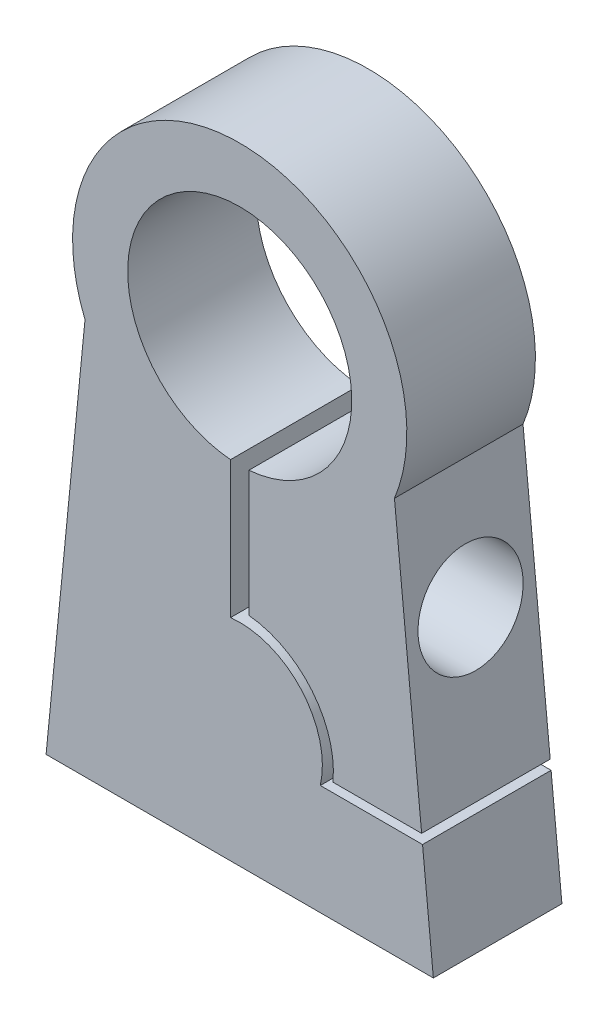
ISO-10303-21;
HEADER;
FILE_DESCRIPTION(('STEP AP214'),'2;1');
FILE_NAME('part.step','',(''),(''),'','','');
FILE_SCHEMA(('AUTOMOTIVE_DESIGN { 1 0 10303 214 1 1 1 1 }'));
ENDSEC;
DATA;
#1=APPLICATION_CONTEXT('core data for automotive mechanical design processes');
#2=APPLICATION_PROTOCOL_DEFINITION('international standard','automotive_design',2000,#1);
#3=PRODUCT_CONTEXT('',#1,'mechanical');
#4=PRODUCT('Part','Part','',(#3));
#5=PRODUCT_RELATED_PRODUCT_CATEGORY('part','',(#4));
#6=PRODUCT_DEFINITION_FORMATION('','',#4);
#7=PRODUCT_DEFINITION_CONTEXT('part definition',#1,'design');
#8=PRODUCT_DEFINITION('design','',#6,#7);
#9=PRODUCT_DEFINITION_SHAPE('','',#8);
#10=(LENGTH_UNIT() NAMED_UNIT(*) SI_UNIT(.MILLI.,.METRE.));
#11=(NAMED_UNIT(*) PLANE_ANGLE_UNIT() SI_UNIT($,.RADIAN.));
#12=(NAMED_UNIT(*) SI_UNIT($,.STERADIAN.) SOLID_ANGLE_UNIT());
#13=UNCERTAINTY_MEASURE_WITH_UNIT(LENGTH_MEASURE(1.E-05),#10,'distance_accuracy_value','');
#14=(GEOMETRIC_REPRESENTATION_CONTEXT(3) GLOBAL_UNCERTAINTY_ASSIGNED_CONTEXT((#13)) GLOBAL_UNIT_ASSIGNED_CONTEXT((#10,
#11,#12)) REPRESENTATION_CONTEXT('',''));
#15=CARTESIAN_POINT('',(0.,0.,0.));
#16=DIRECTION('',(0.,0.,1.));
#17=DIRECTION('',(1.,0.,0.));
#18=AXIS2_PLACEMENT_3D('',#15,#16,#17);
#19=CARTESIAN_POINT('',(3.29089653438087,-19.4,0.));
#20=DIRECTION('',(1.,0.,0.));
#21=DIRECTION('',(0.,0.,-1.));
#22=AXIS2_PLACEMENT_3D('',#19,#20,#21);
#23=PLANE('',#22);
#24=DIRECTION('',(0.,0.,1.));
#25=VECTOR('',#24,1.);
#26=CARTESIAN_POINT('',(3.29089653438087,-22.,0.));
#27=LINE('',#26,#25);
#28=CARTESIAN_POINT('',(3.29089653438087,-22.,0.));
#29=VERTEX_POINT('',#28);
#30=CARTESIAN_POINT('',(3.29089653438087,-22.,2.85));
#31=VERTEX_POINT('',#30);
#32=EDGE_CURVE('E261',#29,#31,#27,.T.);
#33=ORIENTED_EDGE('',*,*,#32,.T.);
#34=DIRECTION('',(0.,-1.,0.));
#35=VECTOR('',#34,1.);
#36=CARTESIAN_POINT('',(3.29089653438087,-19.4,2.85));
#37=LINE('',#36,#35);
#38=CARTESIAN_POINT('',(3.29089653438087,-19.4,2.85));
#39=VERTEX_POINT('',#38);
#40=EDGE_CURVE('E255',#39,#31,#37,.T.);
#41=ORIENTED_EDGE('',*,*,#40,.F.);
#42=DIRECTION('',(0.,0.,1.));
#43=VECTOR('',#42,1.);
#44=CARTESIAN_POINT('',(3.29089653438087,-19.4,0.));
#45=LINE('',#44,#43);
#46=CARTESIAN_POINT('',(3.29089653438087,-19.4,0.));
#47=VERTEX_POINT('',#46);
#48=EDGE_CURVE('E258',#47,#39,#45,.T.);
#49=ORIENTED_EDGE('',*,*,#48,.F.);
#50=DIRECTION('',(0.,-1.,0.));
#51=VECTOR('',#50,1.);
#52=CARTESIAN_POINT('',(3.29089653438087,-19.4,0.));
#53=LINE('',#52,#51);
#54=EDGE_CURVE('E306',#47,#29,#53,.T.);
#55=ORIENTED_EDGE('',*,*,#54,.T.);
#56=EDGE_LOOP('',(#33,#41,#49,#55));
#57=FACE_BOUND('',#56,.T.);
#58=ADVANCED_FACE('F94',(#57),#23,.F.);
#59=CARTESIAN_POINT('',(1.64544826719043,-19.4,-2.85));
#60=DIRECTION('',(0.866025403784439,0.,-0.5));
#61=DIRECTION('',(-0.5,0.,-0.866025403784439));
#62=AXIS2_PLACEMENT_3D('',#59,#60,#61);
#63=PLANE('',#62);
#64=DIRECTION('',(0.5,0.,0.866025403784439));
#65=VECTOR('',#64,1.);
#66=CARTESIAN_POINT('',(1.64544826719043,-22.,-2.85));
#67=LINE('',#66,#65);
#68=CARTESIAN_POINT('',(1.64544826719043,-22.,-2.85));
#69=VERTEX_POINT('',#68);
#70=EDGE_CURVE('E279',#69,#29,#67,.T.);
#71=ORIENTED_EDGE('',*,*,#70,.T.);
#72=ORIENTED_EDGE('',*,*,#54,.F.);
#73=DIRECTION('',(0.5,0.,0.866025403784439));
#74=VECTOR('',#73,1.);
#75=CARTESIAN_POINT('',(1.64544826719043,-19.4,-2.85));
#76=LINE('',#75,#74);
#77=CARTESIAN_POINT('',(1.64544826719043,-19.4,-2.85));
#78=VERTEX_POINT('',#77);
#79=EDGE_CURVE('E266',#78,#47,#76,.T.);
#80=ORIENTED_EDGE('',*,*,#79,.F.);
#81=DIRECTION('',(0.,-1.,0.));
#82=VECTOR('',#81,1.);
#83=CARTESIAN_POINT('',(1.64544826719043,-19.4,-2.85));
#84=LINE('',#83,#82);
#85=EDGE_CURVE('E309',#78,#69,#84,.T.);
#86=ORIENTED_EDGE('',*,*,#85,.T.);
#87=EDGE_LOOP('',(#71,#72,#80,#86));
#88=FACE_BOUND('',#87,.T.);
#89=ADVANCED_FACE('F532',(#88),#63,.F.);
#90=CARTESIAN_POINT('',(-1.64544826719043,-19.4,-2.85));
#91=DIRECTION('',(0.,0.,-1.));
#92=DIRECTION('',(-1.,0.,0.));
#93=AXIS2_PLACEMENT_3D('',#90,#91,#92);
#94=PLANE('',#93);
#95=DIRECTION('',(1.,0.,0.));
#96=VECTOR('',#95,1.);
#97=CARTESIAN_POINT('',(-1.64544826719043,-22.,-2.85));
#98=LINE('',#97,#96);
#99=CARTESIAN_POINT('',(-1.64544826719043,-22.,-2.85));
#100=VERTEX_POINT('',#99);
#101=EDGE_CURVE('E282',#100,#69,#98,.T.);
#102=ORIENTED_EDGE('',*,*,#101,.T.);
#103=ORIENTED_EDGE('',*,*,#85,.F.);
#104=DIRECTION('',(1.,0.,0.));
#105=VECTOR('',#104,1.);
#106=CARTESIAN_POINT('',(-1.64544826719043,-19.4,-2.85));
#107=LINE('',#106,#105);
#108=CARTESIAN_POINT('',(-1.64544826719043,-19.4,-2.85));
#109=VERTEX_POINT('',#108);
#110=EDGE_CURVE('E292',#109,#78,#107,.T.);
#111=ORIENTED_EDGE('',*,*,#110,.F.);
#112=DIRECTION('',(0.,-1.,0.));
#113=VECTOR('',#112,1.);
#114=CARTESIAN_POINT('',(-1.64544826719043,-19.4,-2.85));
#115=LINE('',#114,#113);
#116=EDGE_CURVE('E311',#109,#100,#115,.T.);
#117=ORIENTED_EDGE('',*,*,#116,.T.);
#118=EDGE_LOOP('',(#102,#103,#111,#117));
#119=FACE_BOUND('',#118,.T.);
#120=ADVANCED_FACE('F538',(#119),#94,.F.);
#121=CARTESIAN_POINT('',(-3.29089653438087,-19.4,0.));
#122=DIRECTION('',(-0.866025403784439,0.,-0.5));
#123=DIRECTION('',(-0.5,0.,0.866025403784439));
#124=AXIS2_PLACEMENT_3D('',#121,#122,#123);
#125=PLANE('',#124);
#126=DIRECTION('',(0.5,0.,-0.866025403784439));
#127=VECTOR('',#126,1.);
#128=CARTESIAN_POINT('',(-3.29089653438087,-22.,0.));
#129=LINE('',#128,#127);
#130=CARTESIAN_POINT('',(-3.29089653438087,-22.,0.));
#131=VERTEX_POINT('',#130);
#132=EDGE_CURVE('E301',#131,#100,#129,.T.);
#133=ORIENTED_EDGE('',*,*,#132,.T.);
#134=ORIENTED_EDGE('',*,*,#116,.F.);
#135=DIRECTION('',(0.5,0.,-0.866025403784439));
#136=VECTOR('',#135,1.);
#137=CARTESIAN_POINT('',(-3.29089653438087,-19.4,0.));
#138=LINE('',#137,#136);
#139=CARTESIAN_POINT('',(-3.29089653438087,-19.4,0.));
#140=VERTEX_POINT('',#139);
#141=EDGE_CURVE('E289',#140,#109,#138,.T.);
#142=ORIENTED_EDGE('',*,*,#141,.F.);
#143=DIRECTION('',(0.,-1.,0.));
#144=VECTOR('',#143,1.);
#145=CARTESIAN_POINT('',(-3.29089653438087,-19.4,0.));
#146=LINE('',#145,#144);
#147=EDGE_CURVE('E313',#140,#131,#146,.T.);
#148=ORIENTED_EDGE('',*,*,#147,.T.);
#149=EDGE_LOOP('',(#133,#134,#142,#148));
#150=FACE_BOUND('',#149,.T.);
#151=ADVANCED_FACE('F733',(#150),#125,.F.);
#152=CARTESIAN_POINT('',(-3.29089653438087,-19.4,0.));
#153=DIRECTION('',(-1.,0.,0.));
#154=DIRECTION('',(0.,0.,1.));
#155=AXIS2_PLACEMENT_3D('',#152,#153,#154);
#156=PLANE('',#155);
#157=DIRECTION('',(0.,0.,-1.));
#158=VECTOR('',#157,1.);
#159=CARTESIAN_POINT('',(-3.29089653438087,-22.,0.));
#160=LINE('',#159,#158);
#161=CARTESIAN_POINT('',(-3.29089653438087,-22.,2.85));
#162=VERTEX_POINT('',#161);
#163=EDGE_CURVE('E298',#162,#131,#160,.T.);
#164=ORIENTED_EDGE('',*,*,#163,.T.);
#165=ORIENTED_EDGE('',*,*,#147,.F.);
#166=DIRECTION('',(0.,0.,-1.));
#167=VECTOR('',#166,1.);
#168=CARTESIAN_POINT('',(-3.29089653438087,-19.4,0.));
#169=LINE('',#168,#167);
#170=CARTESIAN_POINT('',(-3.29089653438087,-19.4,2.85));
#171=VERTEX_POINT('',#170);
#172=EDGE_CURVE('E274',#171,#140,#169,.T.);
#173=ORIENTED_EDGE('',*,*,#172,.F.);
#174=DIRECTION('',(0.,-1.,0.));
#175=VECTOR('',#174,1.);
#176=CARTESIAN_POINT('',(-3.29089653438087,-19.4,2.85));
#177=LINE('',#176,#175);
#178=EDGE_CURVE('E265',#171,#162,#177,.T.);
#179=ORIENTED_EDGE('',*,*,#178,.T.);
#180=EDGE_LOOP('',(#164,#165,#173,#179));
#181=FACE_BOUND('',#180,.T.);
#182=ADVANCED_FACE('F725',(#181),#156,.F.);
#183=CARTESIAN_POINT('',(3.29089653438087,-19.4,2.85));
#184=DIRECTION('',(0.,0.,1.));
#185=DIRECTION('',(1.,0.,0.));
#186=AXIS2_PLACEMENT_3D('',#183,#184,#185);
#187=PLANE('',#186);
#188=DIRECTION('',(-1.,0.,0.));
#189=VECTOR('',#188,1.);
#190=CARTESIAN_POINT('',(3.29089653438087,-22.,2.85));
#191=LINE('',#190,#189);
#192=EDGE_CURVE('E296',#31,#162,#191,.T.);
#193=ORIENTED_EDGE('',*,*,#192,.T.);
#194=ORIENTED_EDGE('',*,*,#178,.F.);
#195=DIRECTION('',(-1.,0.,0.));
#196=VECTOR('',#195,1.);
#197=CARTESIAN_POINT('',(3.29089653438087,-19.4,2.85));
#198=LINE('',#197,#196);
#199=EDGE_CURVE('E269',#39,#171,#198,.T.);
#200=ORIENTED_EDGE('',*,*,#199,.F.);
#201=ORIENTED_EDGE('',*,*,#40,.T.);
#202=EDGE_LOOP('',(#193,#194,#200,#201));
#203=FACE_BOUND('',#202,.T.);
#204=ADVANCED_FACE('F270',(#203),#187,.F.);
#205=CARTESIAN_POINT('',(0.,-19.4,0.));
#206=DIRECTION('',(0.,-1.,0.));
#207=DIRECTION('',(0.,0.,-1.));
#208=AXIS2_PLACEMENT_3D('',#205,#206,#207);
#209=PLANE('',#208);
#210=CARTESIAN_POINT('',(0.,-19.4,0.));
#211=DIRECTION('',(0.,-1.,0.));
#212=DIRECTION('',(0.,0.,-1.));
#213=AXIS2_PLACEMENT_3D('',#210,#211,#212);
#214=CIRCLE('',#213,1.55);
#215=CARTESIAN_POINT('',(0.,-19.4,-1.55));
#216=VERTEX_POINT('',#215);
#217=EDGE_CURVE('E285',#216,#216,#214,.T.);
#218=ORIENTED_EDGE('',*,*,#217,.F.);
#219=EDGE_LOOP('',(#218));
#220=FACE_BOUND('',#219,.T.);
#221=ORIENTED_EDGE('',*,*,#48,.T.);
#222=ORIENTED_EDGE('',*,*,#199,.T.);
#223=ORIENTED_EDGE('',*,*,#172,.T.);
#224=ORIENTED_EDGE('',*,*,#141,.T.);
#225=ORIENTED_EDGE('',*,*,#110,.T.);
#226=ORIENTED_EDGE('',*,*,#79,.T.);
#227=EDGE_LOOP('',(#221,#222,#223,#224,#225,#226));
#228=FACE_BOUND('',#227,.T.);
#229=ADVANCED_FACE('F276',(#220,#228),#209,.T.);
#230=CARTESIAN_POINT('',(0.,-22.,0.));
#231=DIRECTION('',(0.,-1.,0.));
#232=DIRECTION('',(0.,0.,-1.));
#233=AXIS2_PLACEMENT_3D('',#230,#231,#232);
#234=PLANE('',#233);
#235=CARTESIAN_POINT('',(0.,-22.,0.));
#236=DIRECTION('',(0.,-1.,0.));
#237=DIRECTION('',(0.,0.,-1.));
#238=AXIS2_PLACEMENT_3D('',#235,#236,#237);
#239=CIRCLE('',#238,1.55);
#240=CARTESIAN_POINT('',(0.,-22.,-1.55));
#241=VERTEX_POINT('',#240);
#242=EDGE_CURVE('E98',#241,#241,#239,.T.);
#243=ORIENTED_EDGE('',*,*,#242,.T.);
#244=EDGE_LOOP('',(#243));
#245=FACE_BOUND('',#244,.T.);
#246=ORIENTED_EDGE('',*,*,#32,.F.);
#247=ORIENTED_EDGE('',*,*,#70,.F.);
#248=ORIENTED_EDGE('',*,*,#101,.F.);
#249=ORIENTED_EDGE('',*,*,#132,.F.);
#250=ORIENTED_EDGE('',*,*,#163,.F.);
#251=ORIENTED_EDGE('',*,*,#192,.F.);
#252=EDGE_LOOP('',(#246,#247,#248,#249,#250,#251));
#253=FACE_BOUND('',#252,.T.);
#254=ADVANCED_FACE('F698',(#245,#253),#234,.F.);
#255=CARTESIAN_POINT('',(0.,-16.,0.));
#256=DIRECTION('',(0.,-1.,0.));
#257=DIRECTION('',(0.,0.,-1.));
#258=AXIS2_PLACEMENT_3D('',#255,#256,#257);
#259=CYLINDRICAL_SURFACE('',#258,1.55);
#260=CARTESIAN_POINT('',(0.,-25.,0.));
#261=DIRECTION('',(0.,-1.,0.));
#262=DIRECTION('',(0.,0.,-1.));
#263=AXIS2_PLACEMENT_3D('',#260,#261,#262);
#264=CIRCLE('',#263,1.55);
#265=CARTESIAN_POINT('',(0.,-25.,-1.55));
#266=VERTEX_POINT('',#265);
#267=EDGE_CURVE('E899',#266,#266,#264,.T.);
#268=ORIENTED_EDGE('',*,*,#267,.T.);
#269=EDGE_LOOP('',(#268));
#270=FACE_BOUND('',#269,.T.);
#271=ORIENTED_EDGE('',*,*,#242,.F.);
#272=EDGE_LOOP('',(#271));
#273=FACE_BOUND('',#272,.T.);
#274=ADVANCED_FACE('F688',(#270,#273),#259,.F.);
#275=ORIENTED_EDGE('',*,*,#217,.T.);
#276=EDGE_LOOP('',(#275));
#277=FACE_BOUND('',#276,.T.);
#278=CARTESIAN_POINT('',(0.,-16.,0.));
#279=DIRECTION('',(0.,-1.,0.));
#280=DIRECTION('',(0.,0.,-1.));
#281=AXIS2_PLACEMENT_3D('',#278,#279,#280);
#282=CIRCLE('',#281,1.55);
#283=CARTESIAN_POINT('',(0.,-16.,-1.55));
#284=VERTEX_POINT('',#283);
#285=EDGE_CURVE('E896',#284,#284,#282,.T.);
#286=ORIENTED_EDGE('',*,*,#285,.F.);
#287=EDGE_LOOP('',(#286));
#288=FACE_BOUND('',#287,.T.);
#289=ADVANCED_FACE('F678',(#277,#288),#259,.F.);
#290=CARTESIAN_POINT('',(0.,-16.,0.));
#291=DIRECTION('',(0.,-1.,0.));
#292=DIRECTION('',(0.,0.,-1.));
#293=AXIS2_PLACEMENT_3D('',#290,#291,#292);
#294=PLANE('',#293);
#295=ORIENTED_EDGE('',*,*,#285,.T.);
#296=EDGE_LOOP('',(#295));
#297=FACE_BOUND('',#296,.T.);
#298=ADVANCED_FACE('F673',(#297),#294,.T.);
#299=CARTESIAN_POINT('',(13.,-50.,3.5));
#300=DIRECTION('',(-0.99520551532238,-0.0978058396616273,0.));
#301=DIRECTION('',(0.0978058396616273,-0.99520551532238,0.));
#302=AXIS2_PLACEMENT_3D('',#299,#300,#301);
#303=PLANE('',#302);
#304=DIRECTION('',(-0.0978058396616273,0.99520551532238,0.));
#305=VECTOR('',#304,1.);
#306=CARTESIAN_POINT('',(13.,-50.,3.5));
#307=LINE('',#306,#305);
#308=CARTESIAN_POINT('',(10.5430743159129,-25.,3.5));
#309=VERTEX_POINT('',#308);
#310=CARTESIAN_POINT('',(9.953412151732,-19.,3.5));
#311=VERTEX_POINT('',#310);
#312=EDGE_CURVE('E444',#309,#311,#307,.T.);
#313=ORIENTED_EDGE('',*,*,#312,.F.);
#314=DIRECTION('',(0.,0.,-1.));
#315=VECTOR('',#314,1.);
#316=CARTESIAN_POINT('',(10.5430743159129,-25.,3.5));
#317=LINE('',#316,#315);
#318=CARTESIAN_POINT('',(10.5430743159129,-25.,-3.5));
#319=VERTEX_POINT('',#318);
#320=EDGE_CURVE('E318',#309,#319,#317,.T.);
#321=ORIENTED_EDGE('',*,*,#320,.T.);
#322=DIRECTION('',(-0.0978058396616273,0.99520551532238,0.));
#323=VECTOR('',#322,1.);
#324=CARTESIAN_POINT('',(13.,-50.,-3.5));
#325=LINE('',#324,#323);
#326=CARTESIAN_POINT('',(9.95341215173201,-19.,-3.5));
#327=VERTEX_POINT('',#326);
#328=EDGE_CURVE('E452',#319,#327,#325,.T.);
#329=ORIENTED_EDGE('',*,*,#328,.T.);
#330=DIRECTION('',(0.,0.,1.));
#331=VECTOR('',#330,1.);
#332=CARTESIAN_POINT('',(9.95341215173201,-19.,3.5));
#333=LINE('',#332,#331);
#334=EDGE_CURVE('E346',#327,#311,#333,.T.);
#335=ORIENTED_EDGE('',*,*,#334,.T.);
#336=EDGE_LOOP('',(#313,#321,#329,#335));
#337=FACE_BOUND('',#336,.T.);
#338=ADVANCED_FACE('F504',(#337),#303,.F.);
#339=CARTESIAN_POINT('',(0.,0.,3.5));
#340=DIRECTION('',(0.,0.,-1.));
#341=DIRECTION('',(-1.,0.,0.));
#342=AXIS2_PLACEMENT_3D('',#339,#340,#341);
#343=PLANE('',#342);
#344=DIRECTION('',(-0.0978058396616273,-0.99520551532238,0.));
#345=VECTOR('',#344,1.);
#346=CARTESIAN_POINT('',(-13.,-50.,3.5));
#347=LINE('',#346,#345);
#348=CARTESIAN_POINT('',(-8.42432395212559,-3.44104140481383,3.5));
#349=VERTEX_POINT('',#348);
#350=CARTESIAN_POINT('',(-10.5430743159129,-25.,3.5));
#351=VERTEX_POINT('',#350);
#352=EDGE_CURVE('E439',#349,#351,#347,.T.);
#353=ORIENTED_EDGE('',*,*,#352,.T.);
#354=DIRECTION('',(1.,0.,0.));
#355=VECTOR('',#354,1.);
#356=CARTESIAN_POINT('',(0.,-25.,3.5));
#357=LINE('',#356,#355);
#358=EDGE_CURVE('E110',#351,#309,#357,.T.);
#359=ORIENTED_EDGE('',*,*,#358,.T.);
#360=ORIENTED_EDGE('',*,*,#312,.T.);
#361=DIRECTION('',(1.,0.,0.));
#362=VECTOR('',#361,1.);
#363=CARTESIAN_POINT('',(4.,-19.,3.5));
#364=LINE('',#363,#362);
#365=CARTESIAN_POINT('',(4.38748219369606,-19.,3.5));
#366=VERTEX_POINT('',#365);
#367=EDGE_CURVE('E333',#366,#311,#364,.T.);
#368=ORIENTED_EDGE('',*,*,#367,.F.);
#369=CARTESIAN_POINT('',(0.,-18.,3.5));
#370=DIRECTION('',(0.,0.,1.));
#371=DIRECTION('',(1.,0.,0.));
#372=AXIS2_PLACEMENT_3D('',#369,#370,#371);
#373=CIRCLE('',#372,4.5);
#374=CARTESIAN_POINT('',(-0.499999999999999,-13.5278640450004,3.5));
#375=VERTEX_POINT('',#374);
#376=EDGE_CURVE('E322',#366,#375,#373,.T.);
#377=ORIENTED_EDGE('',*,*,#376,.T.);
#378=DIRECTION('',(0.,-1.,0.));
#379=VECTOR('',#378,1.);
#380=CARTESIAN_POINT('',(-0.500000000000001,0.,3.5));
#381=LINE('',#380,#379);
#382=CARTESIAN_POINT('',(-0.5,-6.07947366142827,3.5));
#383=VERTEX_POINT('',#382);
#384=EDGE_CURVE('E412',#383,#375,#381,.T.);
#385=ORIENTED_EDGE('',*,*,#384,.F.);
#386=CARTESIAN_POINT('',(0.,0.,3.5));
#387=DIRECTION('',(0.,0.,1.));
#388=DIRECTION('',(1.,0.,0.));
#389=AXIS2_PLACEMENT_3D('',#386,#387,#388);
#390=CIRCLE('',#389,6.1);
#391=CARTESIAN_POINT('',(0.500000000000001,-6.07947366142827,3.5));
#392=VERTEX_POINT('',#391);
#393=EDGE_CURVE('E433',#392,#383,#390,.T.);
#394=ORIENTED_EDGE('',*,*,#393,.F.);
#395=DIRECTION('',(0.,1.,0.));
#396=VECTOR('',#395,1.);
#397=CARTESIAN_POINT('',(0.500000000000001,0.,3.5));
#398=LINE('',#397,#396);
#399=CARTESIAN_POINT('',(0.500000000000001,-12.9245689838202,3.5));
#400=VERTEX_POINT('',#399);
#401=EDGE_CURVE('E415',#400,#392,#398,.T.);
#402=ORIENTED_EDGE('',*,*,#401,.F.);
#403=CARTESIAN_POINT('',(0.,-18.,3.5));
#404=DIRECTION('',(0.,0.,1.));
#405=DIRECTION('',(1.,0.,0.));
#406=AXIS2_PLACEMENT_3D('',#403,#404,#405);
#407=CIRCLE('',#406,5.1);
#408=CARTESIAN_POINT('',(5.07543101617981,-18.5,3.5));
#409=VERTEX_POINT('',#408);
#410=EDGE_CURVE('E402',#409,#400,#407,.T.);
#411=ORIENTED_EDGE('',*,*,#410,.F.);
#412=DIRECTION('',(-1.,0.,0.));
#413=VECTOR('',#412,1.);
#414=CARTESIAN_POINT('',(4.,-18.5,3.5));
#415=LINE('',#414,#413);
#416=CARTESIAN_POINT('',(9.90427363805026,-18.5,3.5));
#417=VERTEX_POINT('',#416);
#418=EDGE_CURVE('E117',#417,#409,#415,.T.);
#419=ORIENTED_EDGE('',*,*,#418,.F.);
#420=CARTESIAN_POINT('',(8.42432395212559,-3.44104140481383,3.5));
#421=VERTEX_POINT('',#420);
#422=EDGE_CURVE('E442',#417,#421,#307,.T.);
#423=ORIENTED_EDGE('',*,*,#422,.T.);
#424=CARTESIAN_POINT('',(0.,0.,3.5));
#425=DIRECTION('',(0.,0.,1.));
#426=DIRECTION('',(-1.,0.,0.));
#427=AXIS2_PLACEMENT_3D('',#424,#425,#426);
#428=CIRCLE('',#427,9.1);
#429=EDGE_CURVE('E446',#421,#349,#428,.T.);
#430=ORIENTED_EDGE('',*,*,#429,.T.);
#431=EDGE_LOOP('',(#353,#359,#360,#368,#377,#385,#394,#402,#411,#419,#423,#430));
#432=FACE_BOUND('',#431,.T.);
#433=ADVANCED_FACE('F471',(#432),#343,.F.);
#434=CARTESIAN_POINT('',(0.,0.,-3.5));
#435=DIRECTION('',(0.,0.,-1.));
#436=DIRECTION('',(-1.,0.,0.));
#437=AXIS2_PLACEMENT_3D('',#434,#435,#436);
#438=PLANE('',#437);
#439=DIRECTION('',(1.,0.,0.));
#440=VECTOR('',#439,1.);
#441=CARTESIAN_POINT('',(0.,-25.,-3.5));
#442=LINE('',#441,#440);
#443=CARTESIAN_POINT('',(-10.5430743159129,-25.,-3.5));
#444=VERTEX_POINT('',#443);
#445=EDGE_CURVE('E308',#444,#319,#442,.T.);
#446=ORIENTED_EDGE('',*,*,#445,.F.);
#447=DIRECTION('',(-0.0978058396616273,-0.99520551532238,0.));
#448=VECTOR('',#447,1.);
#449=CARTESIAN_POINT('',(-13.,-50.,-3.5));
#450=LINE('',#449,#448);
#451=CARTESIAN_POINT('',(-8.42432395212559,-3.44104140481383,-3.5));
#452=VERTEX_POINT('',#451);
#453=EDGE_CURVE('E436',#452,#444,#450,.T.);
#454=ORIENTED_EDGE('',*,*,#453,.F.);
#455=CARTESIAN_POINT('',(0.,0.,-3.5));
#456=DIRECTION('',(0.,0.,1.));
#457=DIRECTION('',(-1.,0.,0.));
#458=AXIS2_PLACEMENT_3D('',#455,#456,#457);
#459=CIRCLE('',#458,9.1);
#460=CARTESIAN_POINT('',(8.42432395212559,-3.44104140481383,-3.5));
#461=VERTEX_POINT('',#460);
#462=EDGE_CURVE('E443',#461,#452,#459,.T.);
#463=ORIENTED_EDGE('',*,*,#462,.F.);
#464=CARTESIAN_POINT('',(9.90427363805027,-18.5,-3.5));
#465=VERTEX_POINT('',#464);
#466=EDGE_CURVE('E451',#465,#461,#325,.T.);
#467=ORIENTED_EDGE('',*,*,#466,.F.);
#468=DIRECTION('',(-1.,0.,0.));
#469=VECTOR('',#468,1.);
#470=CARTESIAN_POINT('',(4.,-18.5,-3.5));
#471=LINE('',#470,#469);
#472=CARTESIAN_POINT('',(5.07543101617981,-18.5,-3.5));
#473=VERTEX_POINT('',#472);
#474=EDGE_CURVE('E340',#465,#473,#471,.T.);
#475=ORIENTED_EDGE('',*,*,#474,.T.);
#476=CARTESIAN_POINT('',(0.,-18.,-3.5));
#477=DIRECTION('',(0.,0.,-1.));
#478=DIRECTION('',(-1.,0.,0.));
#479=AXIS2_PLACEMENT_3D('',#476,#477,#478);
#480=CIRCLE('',#479,5.1);
#481=CARTESIAN_POINT('',(0.500000000000001,-12.9245689838202,-3.5));
#482=VERTEX_POINT('',#481);
#483=EDGE_CURVE('E417',#473,#482,#480,.F.);
#484=ORIENTED_EDGE('',*,*,#483,.T.);
#485=DIRECTION('',(0.,1.,0.));
#486=VECTOR('',#485,1.);
#487=CARTESIAN_POINT('',(0.500000000000001,0.,-3.5));
#488=LINE('',#487,#486);
#489=CARTESIAN_POINT('',(0.500000000000001,-6.07947366142827,-3.5));
#490=VERTEX_POINT('',#489);
#491=EDGE_CURVE('E414',#482,#490,#488,.T.);
#492=ORIENTED_EDGE('',*,*,#491,.T.);
#493=CARTESIAN_POINT('',(0.,0.,-3.5));
#494=DIRECTION('',(0.,0.,1.));
#495=DIRECTION('',(1.,0.,0.));
#496=AXIS2_PLACEMENT_3D('',#493,#494,#495);
#497=CIRCLE('',#496,6.1);
#498=CARTESIAN_POINT('',(-0.5,-6.07947366142827,-3.5));
#499=VERTEX_POINT('',#498);
#500=EDGE_CURVE('E430',#490,#499,#497,.T.);
#501=ORIENTED_EDGE('',*,*,#500,.T.);
#502=DIRECTION('',(0.,-1.,0.));
#503=VECTOR('',#502,1.);
#504=CARTESIAN_POINT('',(-0.500000000000001,0.,-3.5));
#505=LINE('',#504,#503);
#506=CARTESIAN_POINT('',(-0.499999999999999,-13.5278640450004,-3.5));
#507=VERTEX_POINT('',#506);
#508=EDGE_CURVE('E421',#499,#507,#505,.T.);
#509=ORIENTED_EDGE('',*,*,#508,.T.);
#510=CARTESIAN_POINT('',(0.,-18.,-3.5));
#511=DIRECTION('',(0.,0.,1.));
#512=DIRECTION('',(1.,0.,0.));
#513=AXIS2_PLACEMENT_3D('',#510,#511,#512);
#514=CIRCLE('',#513,4.5);
#515=CARTESIAN_POINT('',(4.38748219369606,-19.,-3.5));
#516=VERTEX_POINT('',#515);
#517=EDGE_CURVE('E321',#516,#507,#514,.T.);
#518=ORIENTED_EDGE('',*,*,#517,.F.);
#519=DIRECTION('',(1.,0.,0.));
#520=VECTOR('',#519,1.);
#521=CARTESIAN_POINT('',(4.,-19.,-3.5));
#522=LINE('',#521,#520);
#523=EDGE_CURVE('E335',#516,#327,#522,.T.);
#524=ORIENTED_EDGE('',*,*,#523,.T.);
#525=ORIENTED_EDGE('',*,*,#328,.F.);
#526=EDGE_LOOP('',(#446,#454,#463,#467,#475,#484,#492,#501,#509,#518,#524,#525));
#527=FACE_BOUND('',#526,.T.);
#528=ADVANCED_FACE('F484',(#527),#438,.T.);
#529=CARTESIAN_POINT('',(-13.,-50.,3.5));
#530=DIRECTION('',(0.99520551532238,-0.0978058396616273,0.));
#531=DIRECTION('',(0.0978058396616273,0.99520551532238,0.));
#532=AXIS2_PLACEMENT_3D('',#529,#530,#531);
#533=PLANE('',#532);
#534=ORIENTED_EDGE('',*,*,#453,.T.);
#535=DIRECTION('',(0.,0.,1.));
#536=VECTOR('',#535,1.);
#537=CARTESIAN_POINT('',(-10.5430743159129,-25.,3.5));
#538=LINE('',#537,#536);
#539=EDGE_CURVE('E12',#444,#351,#538,.T.);
#540=ORIENTED_EDGE('',*,*,#539,.T.);
#541=ORIENTED_EDGE('',*,*,#352,.F.);
#542=DIRECTION('',(0.,0.,-1.));
#543=VECTOR('',#542,1.);
#544=CARTESIAN_POINT('',(-8.42432395212559,-3.44104140481383,3.5));
#545=LINE('',#544,#543);
#546=EDGE_CURVE('E448',#349,#452,#545,.T.);
#547=ORIENTED_EDGE('',*,*,#546,.T.);
#548=EDGE_LOOP('',(#534,#540,#541,#547));
#549=FACE_BOUND('',#548,.T.);
#550=ADVANCED_FACE('F96',(#549),#533,.F.);
#551=CARTESIAN_POINT('',(9.06891890546066,-10.,0.));
#552=DIRECTION('',(-0.99520551532238,-0.0978058396616273,0.));
#553=DIRECTION('',(-0.0978058396616273,0.99520551532238,0.));
#554=AXIS2_PLACEMENT_3D('',#551,#552,#553);
#555=ELLIPSE('',#554,2.86373011013388,2.85);
#556=CARTESIAN_POINT('',(8.78882937747473,-7.15,0.));
#557=VERTEX_POINT('',#556);
#558=EDGE_CURVE('E352',#557,#557,#555,.F.);
#559=ORIENTED_EDGE('',*,*,#558,.F.);
#560=EDGE_LOOP('',(#559));
#561=FACE_BOUND('',#560,.T.);
#562=ORIENTED_EDGE('',*,*,#422,.F.);
#563=DIRECTION('',(0.,0.,-1.));
#564=VECTOR('',#563,1.);
#565=CARTESIAN_POINT('',(9.90427363805027,-18.5,3.5));
#566=LINE('',#565,#564);
#567=EDGE_CURVE('E343',#417,#465,#566,.T.);
#568=ORIENTED_EDGE('',*,*,#567,.T.);
#569=ORIENTED_EDGE('',*,*,#466,.T.);
#570=DIRECTION('',(0.,0.,-1.));
#571=VECTOR('',#570,1.);
#572=CARTESIAN_POINT('',(8.42432395212559,-3.44104140481383,3.5));
#573=LINE('',#572,#571);
#574=EDGE_CURVE('E457',#421,#461,#573,.T.);
#575=ORIENTED_EDGE('',*,*,#574,.F.);
#576=EDGE_LOOP('',(#562,#568,#569,#575));
#577=FACE_BOUND('',#576,.T.);
#578=ADVANCED_FACE('F490',(#561,#577),#303,.F.);
#579=CARTESIAN_POINT('',(0.,0.,3.5));
#580=DIRECTION('',(0.,0.,-1.));
#581=DIRECTION('',(-1.,0.,0.));
#582=AXIS2_PLACEMENT_3D('',#579,#580,#581);
#583=CYLINDRICAL_SURFACE('',#582,9.1);
#584=ORIENTED_EDGE('',*,*,#462,.T.);
#585=ORIENTED_EDGE('',*,*,#546,.F.);
#586=ORIENTED_EDGE('',*,*,#429,.F.);
#587=ORIENTED_EDGE('',*,*,#574,.T.);
#588=EDGE_LOOP('',(#584,#585,#586,#587));
#589=FACE_BOUND('',#588,.T.);
#590=ADVANCED_FACE('F496',(#589),#583,.T.);
#591=CARTESIAN_POINT('',(0.,0.,3.5));
#592=DIRECTION('',(0.,0.,-1.));
#593=DIRECTION('',(-1.,0.,0.));
#594=AXIS2_PLACEMENT_3D('',#591,#592,#593);
#595=CYLINDRICAL_SURFACE('',#594,6.1);
#596=DIRECTION('',(0.,0.,1.));
#597=VECTOR('',#596,1.);
#598=CARTESIAN_POINT('',(0.500000000000001,-6.07947366142827,-17.9249783362056));
#599=LINE('',#598,#597);
#600=EDGE_CURVE('E420',#490,#392,#599,.T.);
#601=ORIENTED_EDGE('',*,*,#600,.T.);
#602=ORIENTED_EDGE('',*,*,#393,.T.);
#603=DIRECTION('',(0.,0.,1.));
#604=VECTOR('',#603,1.);
#605=CARTESIAN_POINT('',(-0.5,-6.07947366142827,-17.9249783362056));
#606=LINE('',#605,#604);
#607=EDGE_CURVE('E424',#499,#383,#606,.T.);
#608=ORIENTED_EDGE('',*,*,#607,.F.);
#609=ORIENTED_EDGE('',*,*,#500,.F.);
#610=EDGE_LOOP('',(#601,#602,#608,#609));
#611=FACE_BOUND('',#610,.T.);
#612=ADVANCED_FACE('F480',(#611),#595,.F.);
#613=CARTESIAN_POINT('',(0.500000000000001,0.,-17.9249783362056));
#614=DIRECTION('',(1.,0.,0.));
#615=DIRECTION('',(0.,1.,0.));
#616=AXIS2_PLACEMENT_3D('',#613,#614,#615);
#617=PLANE('',#616);
#618=CARTESIAN_POINT('',(0.5,-10.,0.));
#619=DIRECTION('',(1.,0.,0.));
#620=DIRECTION('',(0.,1.,0.));
#621=AXIS2_PLACEMENT_3D('',#618,#619,#620);
#622=CIRCLE('',#621,1.55);
#623=CARTESIAN_POINT('',(0.5,-8.45,0.));
#624=VERTEX_POINT('',#623);
#625=EDGE_CURVE('E359',#624,#624,#622,.F.);
#626=ORIENTED_EDGE('',*,*,#625,.F.);
#627=EDGE_LOOP('',(#626));
#628=FACE_BOUND('',#627,.T.);
#629=DIRECTION('',(0.,0.,1.));
#630=VECTOR('',#629,1.);
#631=CARTESIAN_POINT('',(0.500000000000001,-12.9245689838202,-17.9249783362056));
#632=LINE('',#631,#630);
#633=EDGE_CURVE('E423',#482,#400,#632,.T.);
#634=ORIENTED_EDGE('',*,*,#633,.T.);
#635=ORIENTED_EDGE('',*,*,#401,.T.);
#636=ORIENTED_EDGE('',*,*,#600,.F.);
#637=ORIENTED_EDGE('',*,*,#491,.F.);
#638=EDGE_LOOP('',(#634,#635,#636,#637));
#639=FACE_BOUND('',#638,.T.);
#640=ADVANCED_FACE('F476',(#628,#639),#617,.F.);
#641=CARTESIAN_POINT('',(-0.500000000000001,0.,-17.9249783362056));
#642=DIRECTION('',(-1.,0.,0.));
#643=DIRECTION('',(0.,-1.,0.));
#644=AXIS2_PLACEMENT_3D('',#641,#642,#643);
#645=PLANE('',#644);
#646=CARTESIAN_POINT('',(-0.499999999999999,-10.,0.));
#647=DIRECTION('',(-1.,0.,0.));
#648=DIRECTION('',(0.,-1.,0.));
#649=AXIS2_PLACEMENT_3D('',#646,#647,#648);
#650=CIRCLE('',#649,1.55);
#651=CARTESIAN_POINT('',(-0.499999999999999,-11.55,0.));
#652=VERTEX_POINT('',#651);
#653=EDGE_CURVE('E356',#652,#652,#650,.F.);
#654=ORIENTED_EDGE('',*,*,#653,.F.);
#655=EDGE_LOOP('',(#654));
#656=FACE_BOUND('',#655,.T.);
#657=ORIENTED_EDGE('',*,*,#607,.T.);
#658=ORIENTED_EDGE('',*,*,#384,.T.);
#659=DIRECTION('',(0.,0.,-1.));
#660=VECTOR('',#659,1.);
#661=CARTESIAN_POINT('',(-0.499999999999999,-13.5278640450004,3.5));
#662=LINE('',#661,#660);
#663=EDGE_CURVE('E325',#375,#507,#662,.T.);
#664=ORIENTED_EDGE('',*,*,#663,.T.);
#665=ORIENTED_EDGE('',*,*,#508,.F.);
#666=EDGE_LOOP('',(#657,#658,#664,#665));
#667=FACE_BOUND('',#666,.T.);
#668=ADVANCED_FACE('F513',(#656,#667),#645,.F.);
#669=CARTESIAN_POINT('',(0.,-18.,-17.9249783362056));
#670=DIRECTION('',(0.,0.,1.));
#671=DIRECTION('',(1.,0.,0.));
#672=AXIS2_PLACEMENT_3D('',#669,#670,#671);
#673=CYLINDRICAL_SURFACE('',#672,5.1);
#674=ORIENTED_EDGE('',*,*,#483,.F.);
#675=DIRECTION('',(0.,0.,1.));
#676=VECTOR('',#675,1.);
#677=CARTESIAN_POINT('',(5.07543101617981,-18.5,-17.9249783362056));
#678=LINE('',#677,#676);
#679=EDGE_CURVE('E103',#473,#409,#678,.T.);
#680=ORIENTED_EDGE('',*,*,#679,.T.);
#681=ORIENTED_EDGE('',*,*,#410,.T.);
#682=ORIENTED_EDGE('',*,*,#633,.F.);
#683=EDGE_LOOP('',(#674,#680,#681,#682));
#684=FACE_BOUND('',#683,.T.);
#685=ADVANCED_FACE('F467',(#684),#673,.F.);
#686=CARTESIAN_POINT('',(13.4635412391136,-10.,0.));
#687=DIRECTION('',(-1.,0.,0.));
#688=DIRECTION('',(0.,-1.,0.));
#689=AXIS2_PLACEMENT_3D('',#686,#687,#688);
#690=CYLINDRICAL_SURFACE('',#689,1.55);
#691=CARTESIAN_POINT('',(-2.5,-10.,0.));
#692=DIRECTION('',(1.,0.,0.));
#693=DIRECTION('',(0.,1.,0.));
#694=AXIS2_PLACEMENT_3D('',#691,#692,#693);
#695=CIRCLE('',#694,1.55);
#696=CARTESIAN_POINT('',(-2.5,-8.45,0.));
#697=VERTEX_POINT('',#696);
#698=EDGE_CURVE('E360',#697,#697,#695,.F.);
#699=ORIENTED_EDGE('',*,*,#698,.T.);
#700=EDGE_LOOP('',(#699));
#701=FACE_BOUND('',#700,.T.);
#702=ORIENTED_EDGE('',*,*,#653,.T.);
#703=EDGE_LOOP('',(#702));
#704=FACE_BOUND('',#703,.T.);
#705=ADVANCED_FACE('F517',(#701,#704),#690,.F.);
#706=CARTESIAN_POINT('',(3.,-10.,0.));
#707=DIRECTION('',(-1.,0.,0.));
#708=DIRECTION('',(0.,-1.,0.));
#709=AXIS2_PLACEMENT_3D('',#706,#707,#708);
#710=CIRCLE('',#709,1.55);
#711=CARTESIAN_POINT('',(3.,-11.55,0.));
#712=VERTEX_POINT('',#711);
#713=EDGE_CURVE('E355',#712,#712,#710,.T.);
#714=ORIENTED_EDGE('',*,*,#713,.F.);
#715=EDGE_LOOP('',(#714));
#716=FACE_BOUND('',#715,.T.);
#717=ORIENTED_EDGE('',*,*,#625,.T.);
#718=EDGE_LOOP('',(#717));
#719=FACE_BOUND('',#718,.T.);
#720=ADVANCED_FACE('F528',(#716,#719),#690,.F.);
#721=CARTESIAN_POINT('',(-5.1,-6.70910346561914,0.));
#722=DIRECTION('',(0.,1.,0.));
#723=DIRECTION('',(0.,0.,1.));
#724=AXIS2_PLACEMENT_3D('',#721,#722,#723);
#725=PLANE('',#724);
#726=DIRECTION('',(0.,0.,1.));
#727=VECTOR('',#726,1.);
#728=CARTESIAN_POINT('',(-2.5,-6.70910346561914,0.));
#729=LINE('',#728,#727);
#730=CARTESIAN_POINT('',(-2.5,-6.70910346561914,0.));
#731=VERTEX_POINT('',#730);
#732=CARTESIAN_POINT('',(-2.5,-6.70910346561914,2.85));
#733=VERTEX_POINT('',#732);
#734=EDGE_CURVE('E363',#731,#733,#729,.T.);
#735=ORIENTED_EDGE('',*,*,#734,.T.);
#736=DIRECTION('',(1.,0.,0.));
#737=VECTOR('',#736,1.);
#738=CARTESIAN_POINT('',(-5.1,-6.70910346561914,2.85));
#739=LINE('',#738,#737);
#740=CARTESIAN_POINT('',(-5.1,-6.70910346561914,2.85));
#741=VERTEX_POINT('',#740);
#742=EDGE_CURVE('E383',#741,#733,#739,.T.);
#743=ORIENTED_EDGE('',*,*,#742,.F.);
#744=DIRECTION('',(0.,0.,1.));
#745=VECTOR('',#744,1.);
#746=CARTESIAN_POINT('',(-5.1,-6.70910346561914,0.));
#747=LINE('',#746,#745);
#748=CARTESIAN_POINT('',(-5.1,-6.70910346561914,0.));
#749=VERTEX_POINT('',#748);
#750=EDGE_CURVE('E364',#749,#741,#747,.T.);
#751=ORIENTED_EDGE('',*,*,#750,.F.);
#752=DIRECTION('',(1.,0.,0.));
#753=VECTOR('',#752,1.);
#754=CARTESIAN_POINT('',(-5.1,-6.70910346561914,0.));
#755=LINE('',#754,#753);
#756=EDGE_CURVE('E400',#749,#731,#755,.T.);
#757=ORIENTED_EDGE('',*,*,#756,.T.);
#758=EDGE_LOOP('',(#735,#743,#751,#757));
#759=FACE_BOUND('',#758,.T.);
#760=ADVANCED_FACE('F563',(#759),#725,.F.);
#761=CARTESIAN_POINT('',(-5.1,-8.35455173280957,-2.85));
#762=DIRECTION('',(0.,0.866025403784438,-0.5));
#763=DIRECTION('',(0.,0.5,0.866025403784439));
#764=AXIS2_PLACEMENT_3D('',#761,#762,#763);
#765=PLANE('',#764);
#766=DIRECTION('',(0.,0.5,0.866025403784438));
#767=VECTOR('',#766,1.);
#768=CARTESIAN_POINT('',(-2.5,-8.35455173280957,-2.85));
#769=LINE('',#768,#767);
#770=CARTESIAN_POINT('',(-2.5,-8.35455173280957,-2.85));
#771=VERTEX_POINT('',#770);
#772=EDGE_CURVE('E368',#771,#731,#769,.T.);
#773=ORIENTED_EDGE('',*,*,#772,.T.);
#774=ORIENTED_EDGE('',*,*,#756,.F.);
#775=DIRECTION('',(0.,0.5,0.866025403784438));
#776=VECTOR('',#775,1.);
#777=CARTESIAN_POINT('',(-5.1,-8.35455173280957,-2.85));
#778=LINE('',#777,#776);
#779=CARTESIAN_POINT('',(-5.1,-8.35455173280957,-2.85));
#780=VERTEX_POINT('',#779);
#781=EDGE_CURVE('E380',#780,#749,#778,.T.);
#782=ORIENTED_EDGE('',*,*,#781,.F.);
#783=DIRECTION('',(1.,0.,0.));
#784=VECTOR('',#783,1.);
#785=CARTESIAN_POINT('',(-5.1,-8.35455173280957,-2.85));
#786=LINE('',#785,#784);
#787=EDGE_CURVE('E403',#780,#771,#786,.T.);
#788=ORIENTED_EDGE('',*,*,#787,.T.);
#789=EDGE_LOOP('',(#773,#774,#782,#788));
#790=FACE_BOUND('',#789,.T.);
#791=ADVANCED_FACE('F573',(#790),#765,.F.);
#792=CARTESIAN_POINT('',(-5.1,-11.6454482671904,-2.85));
#793=DIRECTION('',(0.,0.,-1.));
#794=DIRECTION('',(0.,1.,0.));
#795=AXIS2_PLACEMENT_3D('',#792,#793,#794);
#796=PLANE('',#795);
#797=DIRECTION('',(0.,1.,0.));
#798=VECTOR('',#797,1.);
#799=CARTESIAN_POINT('',(-2.5,-11.6454482671904,-2.85));
#800=LINE('',#799,#798);
#801=CARTESIAN_POINT('',(-2.5,-11.6454482671904,-2.85));
#802=VERTEX_POINT('',#801);
#803=EDGE_CURVE('E395',#802,#771,#800,.T.);
#804=ORIENTED_EDGE('',*,*,#803,.T.);
#805=ORIENTED_EDGE('',*,*,#787,.F.);
#806=DIRECTION('',(0.,1.,0.));
#807=VECTOR('',#806,1.);
#808=CARTESIAN_POINT('',(-5.1,-11.6454482671904,-2.85));
#809=LINE('',#808,#807);
#810=CARTESIAN_POINT('',(-5.1,-11.6454482671904,-2.85));
#811=VERTEX_POINT('',#810);
#812=EDGE_CURVE('E377',#811,#780,#809,.T.);
#813=ORIENTED_EDGE('',*,*,#812,.F.);
#814=DIRECTION('',(1.,0.,0.));
#815=VECTOR('',#814,1.);
#816=CARTESIAN_POINT('',(-5.1,-11.6454482671904,-2.85));
#817=LINE('',#816,#815);
#818=EDGE_CURVE('E405',#811,#802,#817,.T.);
#819=ORIENTED_EDGE('',*,*,#818,.T.);
#820=EDGE_LOOP('',(#804,#805,#813,#819));
#821=FACE_BOUND('',#820,.T.);
#822=ADVANCED_FACE('F576',(#821),#796,.F.);
#823=CARTESIAN_POINT('',(-5.1,-13.2908965343809,0.));
#824=DIRECTION('',(0.,-0.866025403784439,-0.5));
#825=DIRECTION('',(0.,0.5,-0.866025403784439));
#826=AXIS2_PLACEMENT_3D('',#823,#824,#825);
#827=PLANE('',#826);
#828=DIRECTION('',(0.,0.5,-0.866025403784439));
#829=VECTOR('',#828,1.);
#830=CARTESIAN_POINT('',(-2.5,-13.2908965343809,0.));
#831=LINE('',#830,#829);
#832=CARTESIAN_POINT('',(-2.5,-13.2908965343809,0.));
#833=VERTEX_POINT('',#832);
#834=EDGE_CURVE('E392',#833,#802,#831,.T.);
#835=ORIENTED_EDGE('',*,*,#834,.T.);
#836=ORIENTED_EDGE('',*,*,#818,.F.);
#837=DIRECTION('',(0.,0.5,-0.866025403784439));
#838=VECTOR('',#837,1.);
#839=CARTESIAN_POINT('',(-5.1,-13.2908965343809,0.));
#840=LINE('',#839,#838);
#841=CARTESIAN_POINT('',(-5.1,-13.2908965343809,0.));
#842=VERTEX_POINT('',#841);
#843=EDGE_CURVE('E374',#842,#811,#840,.T.);
#844=ORIENTED_EDGE('',*,*,#843,.F.);
#845=DIRECTION('',(1.,0.,0.));
#846=VECTOR('',#845,1.);
#847=CARTESIAN_POINT('',(-5.1,-13.2908965343809,0.));
#848=LINE('',#847,#846);
#849=EDGE_CURVE('E407',#842,#833,#848,.T.);
#850=ORIENTED_EDGE('',*,*,#849,.T.);
#851=EDGE_LOOP('',(#835,#836,#844,#850));
#852=FACE_BOUND('',#851,.T.);
#853=ADVANCED_FACE('F580',(#852),#827,.F.);
#854=CARTESIAN_POINT('',(-5.1,-13.2908965343809,2.85));
#855=DIRECTION('',(0.,-1.,0.));
#856=DIRECTION('',(0.,0.,-1.));
#857=AXIS2_PLACEMENT_3D('',#854,#855,#856);
#858=PLANE('',#857);
#859=DIRECTION('',(0.,0.,-1.));
#860=VECTOR('',#859,1.);
#861=CARTESIAN_POINT('',(-2.5,-13.2908965343809,2.85));
#862=LINE('',#861,#860);
#863=CARTESIAN_POINT('',(-2.5,-13.2908965343809,2.85));
#864=VERTEX_POINT('',#863);
#865=EDGE_CURVE('E389',#864,#833,#862,.T.);
#866=ORIENTED_EDGE('',*,*,#865,.T.);
#867=ORIENTED_EDGE('',*,*,#849,.F.);
#868=DIRECTION('',(0.,0.,-1.));
#869=VECTOR('',#868,1.);
#870=CARTESIAN_POINT('',(-5.1,-13.2908965343809,2.85));
#871=LINE('',#870,#869);
#872=CARTESIAN_POINT('',(-5.1,-13.2908965343809,2.85));
#873=VERTEX_POINT('',#872);
#874=EDGE_CURVE('E371',#873,#842,#871,.T.);
#875=ORIENTED_EDGE('',*,*,#874,.F.);
#876=DIRECTION('',(1.,0.,0.));
#877=VECTOR('',#876,1.);
#878=CARTESIAN_POINT('',(-5.1,-13.2908965343809,2.85));
#879=LINE('',#878,#877);
#880=EDGE_CURVE('E409',#873,#864,#879,.T.);
#881=ORIENTED_EDGE('',*,*,#880,.T.);
#882=EDGE_LOOP('',(#866,#867,#875,#881));
#883=FACE_BOUND('',#882,.T.);
#884=ADVANCED_FACE('F584',(#883),#858,.F.);
#885=CARTESIAN_POINT('',(-5.1,-6.70910346561914,2.85));
#886=DIRECTION('',(0.,0.,1.));
#887=DIRECTION('',(0.,-1.,0.));
#888=AXIS2_PLACEMENT_3D('',#885,#886,#887);
#889=PLANE('',#888);
#890=DIRECTION('',(0.,-1.,0.));
#891=VECTOR('',#890,1.);
#892=CARTESIAN_POINT('',(-2.5,-6.70910346561914,2.85));
#893=LINE('',#892,#891);
#894=EDGE_CURVE('E386',#733,#864,#893,.T.);
#895=ORIENTED_EDGE('',*,*,#894,.T.);
#896=ORIENTED_EDGE('',*,*,#880,.F.);
#897=DIRECTION('',(0.,-1.,0.));
#898=VECTOR('',#897,1.);
#899=CARTESIAN_POINT('',(-5.1,-6.70910346561914,2.85));
#900=LINE('',#899,#898);
#901=EDGE_CURVE('E367',#741,#873,#900,.T.);
#902=ORIENTED_EDGE('',*,*,#901,.F.);
#903=ORIENTED_EDGE('',*,*,#742,.T.);
#904=EDGE_LOOP('',(#895,#896,#902,#903));
#905=FACE_BOUND('',#904,.T.);
#906=ADVANCED_FACE('F568',(#905),#889,.F.);
#907=CARTESIAN_POINT('',(-5.1,0.,0.));
#908=DIRECTION('',(1.,0.,0.));
#909=DIRECTION('',(0.,1.,0.));
#910=AXIS2_PLACEMENT_3D('',#907,#908,#909);
#911=PLANE('',#910);
#912=ORIENTED_EDGE('',*,*,#750,.T.);
#913=ORIENTED_EDGE('',*,*,#901,.T.);
#914=ORIENTED_EDGE('',*,*,#874,.T.);
#915=ORIENTED_EDGE('',*,*,#843,.T.);
#916=ORIENTED_EDGE('',*,*,#812,.T.);
#917=ORIENTED_EDGE('',*,*,#781,.T.);
#918=EDGE_LOOP('',(#912,#913,#914,#915,#916,#917));
#919=FACE_BOUND('',#918,.T.);
#920=ADVANCED_FACE('F565',(#919),#911,.T.);
#921=CARTESIAN_POINT('',(-2.5,0.,0.));
#922=DIRECTION('',(1.,0.,0.));
#923=DIRECTION('',(0.,1.,0.));
#924=AXIS2_PLACEMENT_3D('',#921,#922,#923);
#925=PLANE('',#924);
#926=ORIENTED_EDGE('',*,*,#698,.F.);
#927=EDGE_LOOP('',(#926));
#928=FACE_BOUND('',#927,.T.);
#929=ORIENTED_EDGE('',*,*,#734,.F.);
#930=ORIENTED_EDGE('',*,*,#772,.F.);
#931=ORIENTED_EDGE('',*,*,#803,.F.);
#932=ORIENTED_EDGE('',*,*,#834,.F.);
#933=ORIENTED_EDGE('',*,*,#865,.F.);
#934=ORIENTED_EDGE('',*,*,#894,.F.);
#935=EDGE_LOOP('',(#929,#930,#931,#932,#933,#934));
#936=FACE_BOUND('',#935,.T.);
#937=ADVANCED_FACE('F559',(#928,#936),#925,.F.);
#938=CARTESIAN_POINT('',(17.1493535189515,-10.,0.));
#939=DIRECTION('',(-1.,0.,0.));
#940=DIRECTION('',(0.,-1.,0.));
#941=AXIS2_PLACEMENT_3D('',#938,#939,#940);
#942=CYLINDRICAL_SURFACE('',#941,2.85);
#943=ORIENTED_EDGE('',*,*,#558,.T.);
#944=EDGE_LOOP('',(#943));
#945=FACE_BOUND('',#944,.T.);
#946=CARTESIAN_POINT('',(3.,-10.,0.));
#947=DIRECTION('',(-1.,0.,0.));
#948=DIRECTION('',(0.,-1.,0.));
#949=AXIS2_PLACEMENT_3D('',#946,#947,#948);
#950=CIRCLE('',#949,2.85);
#951=CARTESIAN_POINT('',(3.,-12.85,0.));
#952=VERTEX_POINT('',#951);
#953=EDGE_CURVE('E349',#952,#952,#950,.T.);
#954=ORIENTED_EDGE('',*,*,#953,.T.);
#955=EDGE_LOOP('',(#954));
#956=FACE_BOUND('',#955,.T.);
#957=ADVANCED_FACE('F556',(#945,#956),#942,.F.);
#958=CARTESIAN_POINT('',(3.,-10.,0.));
#959=DIRECTION('',(-1.,0.,0.));
#960=DIRECTION('',(0.,-1.,0.));
#961=AXIS2_PLACEMENT_3D('',#958,#959,#960);
#962=PLANE('',#961);
#963=ORIENTED_EDGE('',*,*,#713,.T.);
#964=EDGE_LOOP('',(#963));
#965=FACE_BOUND('',#964,.T.);
#966=ORIENTED_EDGE('',*,*,#953,.F.);
#967=EDGE_LOOP('',(#966));
#968=FACE_BOUND('',#967,.T.);
#969=ADVANCED_FACE('F551',(#965,#968),#962,.F.);
#970=CARTESIAN_POINT('',(4.,-18.5,-10.5178344238091));
#971=DIRECTION('',(0.,1.,0.));
#972=DIRECTION('',(0.,0.,1.));
#973=AXIS2_PLACEMENT_3D('',#970,#971,#972);
#974=PLANE('',#973);
#975=ORIENTED_EDGE('',*,*,#418,.T.);
#976=ORIENTED_EDGE('',*,*,#679,.F.);
#977=ORIENTED_EDGE('',*,*,#474,.F.);
#978=ORIENTED_EDGE('',*,*,#567,.F.);
#979=EDGE_LOOP('',(#975,#976,#977,#978));
#980=FACE_BOUND('',#979,.T.);
#981=ADVANCED_FACE('F488',(#980),#974,.F.);
#982=CARTESIAN_POINT('',(4.,-19.,-10.5178344238091));
#983=DIRECTION('',(0.,-1.,0.));
#984=DIRECTION('',(0.,0.,-1.));
#985=AXIS2_PLACEMENT_3D('',#982,#983,#984);
#986=PLANE('',#985);
#987=ORIENTED_EDGE('',*,*,#523,.F.);
#988=DIRECTION('',(0.,0.,-1.));
#989=VECTOR('',#988,1.);
#990=CARTESIAN_POINT('',(4.38748219369606,-19.,3.5));
#991=LINE('',#990,#989);
#992=EDGE_CURVE('E330',#366,#516,#991,.T.);
#993=ORIENTED_EDGE('',*,*,#992,.F.);
#994=ORIENTED_EDGE('',*,*,#367,.T.);
#995=ORIENTED_EDGE('',*,*,#334,.F.);
#996=EDGE_LOOP('',(#987,#993,#994,#995));
#997=FACE_BOUND('',#996,.T.);
#998=ADVANCED_FACE('F506',(#997),#986,.F.);
#999=CARTESIAN_POINT('',(0.,-18.,3.5));
#1000=DIRECTION('',(0.,0.,-1.));
#1001=DIRECTION('',(-1.,0.,0.));
#1002=AXIS2_PLACEMENT_3D('',#999,#1000,#1001);
#1003=CYLINDRICAL_SURFACE('',#1002,4.5);
#1004=ORIENTED_EDGE('',*,*,#517,.T.);
#1005=ORIENTED_EDGE('',*,*,#663,.F.);
#1006=ORIENTED_EDGE('',*,*,#376,.F.);
#1007=ORIENTED_EDGE('',*,*,#992,.T.);
#1008=EDGE_LOOP('',(#1004,#1005,#1006,#1007));
#1009=FACE_BOUND('',#1008,.T.);
#1010=ADVANCED_FACE('F511',(#1009),#1003,.T.);
#1011=CARTESIAN_POINT('',(0.,-25.,0.));
#1012=DIRECTION('',(0.,1.,0.));
#1013=DIRECTION('',(0.,0.,1.));
#1014=AXIS2_PLACEMENT_3D('',#1011,#1012,#1013);
#1015=PLANE('',#1014);
#1016=ORIENTED_EDGE('',*,*,#267,.F.);
#1017=EDGE_LOOP('',(#1016));
#1018=FACE_BOUND('',#1017,.T.);
#1019=ORIENTED_EDGE('',*,*,#358,.F.);
#1020=ORIENTED_EDGE('',*,*,#539,.F.);
#1021=ORIENTED_EDGE('',*,*,#445,.T.);
#1022=ORIENTED_EDGE('',*,*,#320,.F.);
#1023=EDGE_LOOP('',(#1019,#1020,#1021,#1022));
#1024=FACE_BOUND('',#1023,.T.);
#1025=ADVANCED_FACE('F499',(#1018,#1024),#1015,.F.);
#1026=CLOSED_SHELL('',(#58,#89,#120,#151,#182,#204,#229,#254,#274,#289,#298,#338,#433,#528,#550,
#578,#590,#612,#640,#668,#685,#705,#720,#760,#791,#822,#853,#884,#906,#920,#937,#957,#969,#981,
#998,#1010,#1025));
#1027=MANIFOLD_SOLID_BREP('B2',#1026);
#1028=ADVANCED_BREP_SHAPE_REPRESENTATION('',(#18,#1027),#14);
#1029=SHAPE_DEFINITION_REPRESENTATION(#9,#1028);
ENDSEC;
END-ISO-10303-21;
